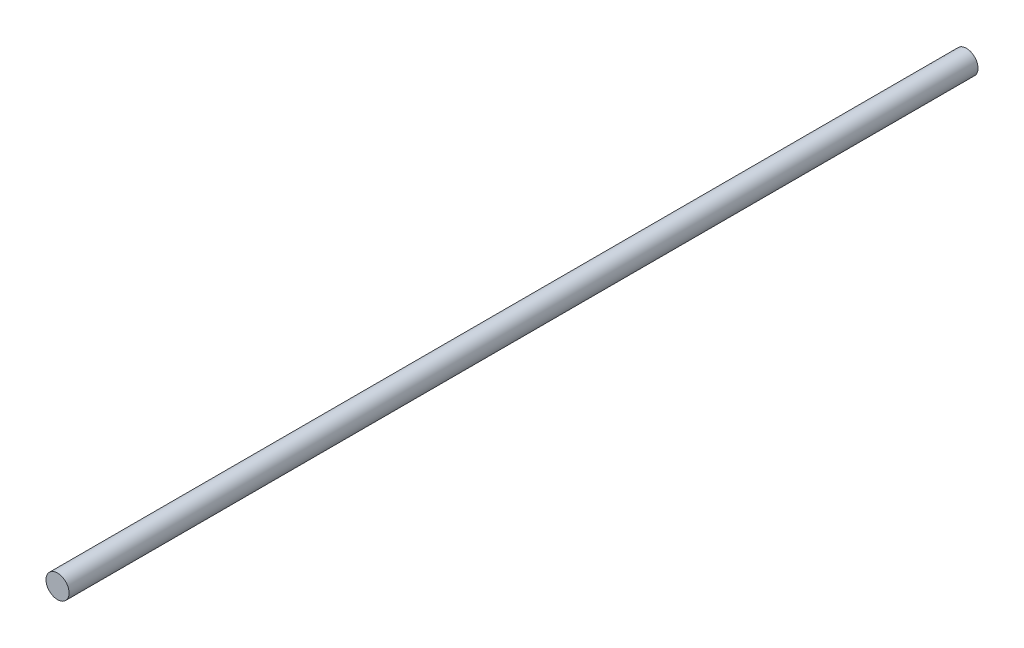
ISO-10303-21;
HEADER;
FILE_DESCRIPTION(('STEP AP214'),'2;1');
FILE_NAME('part.step','',(''),(''),'','','');
FILE_SCHEMA(('AUTOMOTIVE_DESIGN { 1 0 10303 214 1 1 1 1 }'));
ENDSEC;
DATA;
#1=APPLICATION_CONTEXT('core data for automotive mechanical design processes');
#2=APPLICATION_PROTOCOL_DEFINITION('international standard','automotive_design',2000,#1);
#3=PRODUCT_CONTEXT('',#1,'mechanical');
#4=PRODUCT('Part','Part','',(#3));
#5=PRODUCT_RELATED_PRODUCT_CATEGORY('part','',(#4));
#6=PRODUCT_DEFINITION_FORMATION('','',#4);
#7=PRODUCT_DEFINITION_CONTEXT('part definition',#1,'design');
#8=PRODUCT_DEFINITION('design','',#6,#7);
#9=PRODUCT_DEFINITION_SHAPE('','',#8);
#10=(LENGTH_UNIT() NAMED_UNIT(*) SI_UNIT(.MILLI.,.METRE.));
#11=(NAMED_UNIT(*) PLANE_ANGLE_UNIT() SI_UNIT($,.RADIAN.));
#12=(NAMED_UNIT(*) SI_UNIT($,.STERADIAN.) SOLID_ANGLE_UNIT());
#13=UNCERTAINTY_MEASURE_WITH_UNIT(LENGTH_MEASURE(1.E-05),#10,'distance_accuracy_value','');
#14=(GEOMETRIC_REPRESENTATION_CONTEXT(3) GLOBAL_UNCERTAINTY_ASSIGNED_CONTEXT((#13)) GLOBAL_UNIT_ASSIGNED_CONTEXT((#10,
#11,#12)) REPRESENTATION_CONTEXT('',''));
#15=CARTESIAN_POINT('',(0.,0.,0.));
#16=DIRECTION('',(0.,0.,1.));
#17=DIRECTION('',(1.,0.,0.));
#18=AXIS2_PLACEMENT_3D('',#15,#16,#17);
#19=CARTESIAN_POINT('',(0.,0.,157.5));
#20=DIRECTION('',(0.,0.,-1.));
#21=DIRECTION('',(-1.,0.,0.));
#22=AXIS2_PLACEMENT_3D('',#19,#20,#21);
#23=CYLINDRICAL_SURFACE('',#22,4.);
#24=CARTESIAN_POINT('',(0.,0.,157.5));
#25=DIRECTION('',(0.,0.,1.));
#26=DIRECTION('',(1.,0.,0.));
#27=AXIS2_PLACEMENT_3D('',#24,#25,#26);
#28=CIRCLE('',#27,4.);
#29=CARTESIAN_POINT('',(4.,0.,157.5));
#30=VERTEX_POINT('',#29);
#31=EDGE_CURVE('E10',#30,#30,#28,.T.);
#32=ORIENTED_EDGE('',*,*,#31,.F.);
#33=EDGE_LOOP('',(#32));
#34=FACE_BOUND('',#33,.T.);
#35=CARTESIAN_POINT('',(0.,0.,-157.5));
#36=DIRECTION('',(0.,0.,1.));
#37=DIRECTION('',(1.,0.,0.));
#38=AXIS2_PLACEMENT_3D('',#35,#36,#37);
#39=CIRCLE('',#38,4.);
#40=CARTESIAN_POINT('',(4.,0.,-157.5));
#41=VERTEX_POINT('',#40);
#42=EDGE_CURVE('E35',#41,#41,#39,.T.);
#43=ORIENTED_EDGE('',*,*,#42,.T.);
#44=EDGE_LOOP('',(#43));
#45=FACE_BOUND('',#44,.T.);
#46=ADVANCED_FACE('F32',(#34,#45),#23,.T.);
#47=CARTESIAN_POINT('',(0.,0.,157.5));
#48=DIRECTION('',(0.,0.,1.));
#49=DIRECTION('',(1.,0.,0.));
#50=AXIS2_PLACEMENT_3D('',#47,#48,#49);
#51=PLANE('',#50);
#52=ORIENTED_EDGE('',*,*,#31,.T.);
#53=EDGE_LOOP('',(#52));
#54=FACE_BOUND('',#53,.T.);
#55=ADVANCED_FACE('F47',(#54),#51,.T.);
#56=CARTESIAN_POINT('',(0.,0.,-157.5));
#57=DIRECTION('',(0.,0.,1.));
#58=DIRECTION('',(1.,0.,0.));
#59=AXIS2_PLACEMENT_3D('',#56,#57,#58);
#60=PLANE('',#59);
#61=ORIENTED_EDGE('',*,*,#42,.F.);
#62=EDGE_LOOP('',(#61));
#63=FACE_BOUND('',#62,.T.);
#64=ADVANCED_FACE('F45',(#63),#60,.F.);
#65=CLOSED_SHELL('',(#46,#55,#64));
#66=MANIFOLD_SOLID_BREP('B2',#65);
#67=ADVANCED_BREP_SHAPE_REPRESENTATION('',(#18,#66),#14);
#68=SHAPE_DEFINITION_REPRESENTATION(#9,#67);
ENDSEC;
END-ISO-10303-21;
